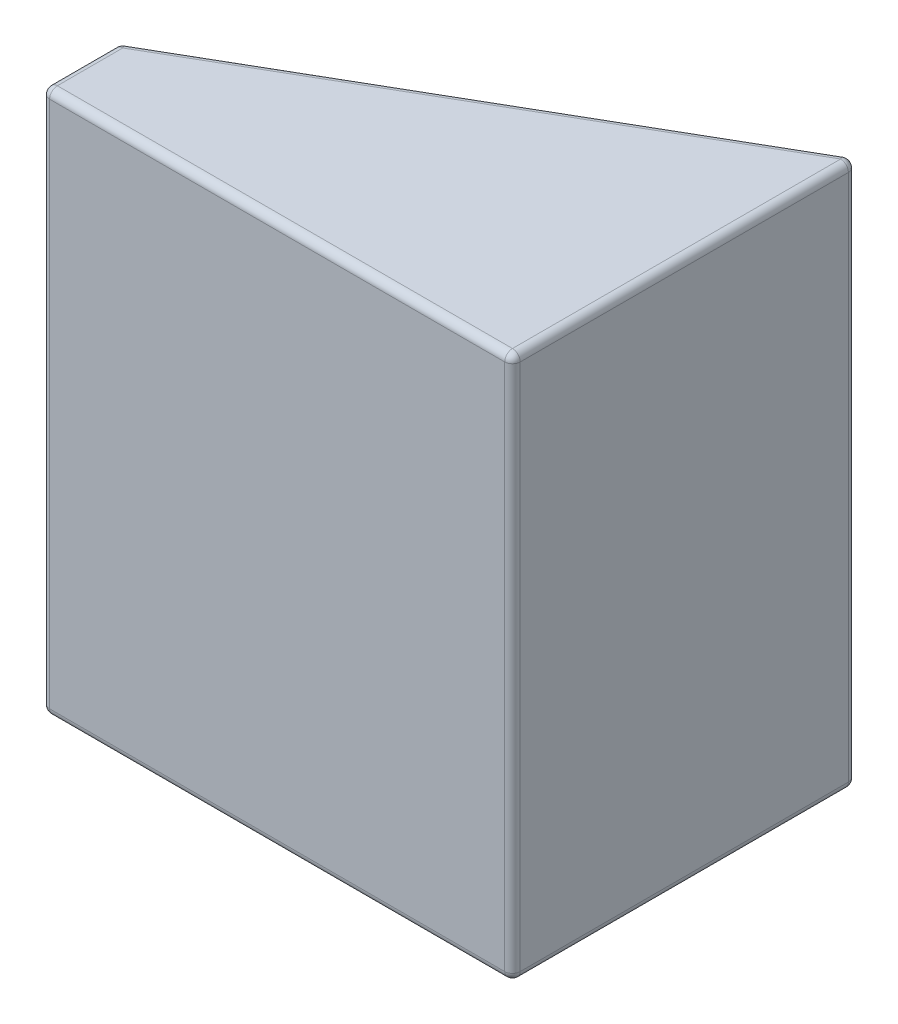
ISO-10303-21;
HEADER;
FILE_DESCRIPTION(('STEP AP214'),'2;1');
FILE_NAME('part.step','',(''),(''),'','','');
FILE_SCHEMA(('AUTOMOTIVE_DESIGN { 1 0 10303 214 1 1 1 1 }'));
ENDSEC;
DATA;
#1=APPLICATION_CONTEXT('core data for automotive mechanical design processes');
#2=APPLICATION_PROTOCOL_DEFINITION('international standard','automotive_design',2000,#1);
#3=PRODUCT_CONTEXT('',#1,'mechanical');
#4=PRODUCT('Part','Part','',(#3));
#5=PRODUCT_RELATED_PRODUCT_CATEGORY('part','',(#4));
#6=PRODUCT_DEFINITION_FORMATION('','',#4);
#7=PRODUCT_DEFINITION_CONTEXT('part definition',#1,'design');
#8=PRODUCT_DEFINITION('design','',#6,#7);
#9=PRODUCT_DEFINITION_SHAPE('','',#8);
#10=(LENGTH_UNIT() NAMED_UNIT(*) SI_UNIT(.MILLI.,.METRE.));
#11=(NAMED_UNIT(*) PLANE_ANGLE_UNIT() SI_UNIT($,.RADIAN.));
#12=(NAMED_UNIT(*) SI_UNIT($,.STERADIAN.) SOLID_ANGLE_UNIT());
#13=UNCERTAINTY_MEASURE_WITH_UNIT(LENGTH_MEASURE(1.E-05),#10,'distance_accuracy_value','');
#14=(GEOMETRIC_REPRESENTATION_CONTEXT(3) GLOBAL_UNCERTAINTY_ASSIGNED_CONTEXT((#13)) GLOBAL_UNIT_ASSIGNED_CONTEXT((#10,
#11,#12)) REPRESENTATION_CONTEXT('',''));
#15=CARTESIAN_POINT('',(0.,0.,0.));
#16=DIRECTION('',(0.,0.,1.));
#17=DIRECTION('',(1.,0.,0.));
#18=AXIS2_PLACEMENT_3D('',#15,#16,#17);
#19=CARTESIAN_POINT('',(153.979316792873,177.8,-88.9));
#20=DIRECTION('',(1.,0.,0.));
#21=DIRECTION('',(0.,0.,-1.));
#22=AXIS2_PLACEMENT_3D('',#19,#20,#21);
#23=PLANE('',#22);
#24=DIRECTION('',(0.,0.,1.));
#25=VECTOR('',#24,1.);
#26=CARTESIAN_POINT('',(153.979316792873,175.26,25.4));
#27=LINE('',#26,#25);
#28=CARTESIAN_POINT('',(153.979316792873,175.26,-84.500590948775));
#29=VERTEX_POINT('',#28);
#30=CARTESIAN_POINT('',(153.979316792873,175.26,22.86));
#31=VERTEX_POINT('',#30);
#32=EDGE_CURVE('E233',#29,#31,#27,.T.);
#33=ORIENTED_EDGE('',*,*,#32,.T.);
#34=DIRECTION('',(0.,-1.,0.));
#35=VECTOR('',#34,1.);
#36=CARTESIAN_POINT('',(153.979316792873,177.8,22.86));
#37=LINE('',#36,#35);
#38=CARTESIAN_POINT('',(153.979316792873,2.54,22.86));
#39=VERTEX_POINT('',#38);
#40=EDGE_CURVE('E235',#31,#39,#37,.T.);
#41=ORIENTED_EDGE('',*,*,#40,.T.);
#42=DIRECTION('',(0.,0.,1.));
#43=VECTOR('',#42,1.);
#44=CARTESIAN_POINT('',(153.979316792873,2.53999999999999,-88.9));
#45=LINE('',#44,#43);
#46=CARTESIAN_POINT('',(153.979316792873,2.54,-84.500590948775));
#47=VERTEX_POINT('',#46);
#48=EDGE_CURVE('E231',#39,#47,#45,.F.);
#49=ORIENTED_EDGE('',*,*,#48,.T.);
#50=DIRECTION('',(0.,-1.,0.));
#51=VECTOR('',#50,1.);
#52=CARTESIAN_POINT('',(153.979316792873,177.8,-84.500590948775));
#53=LINE('',#52,#51);
#54=EDGE_CURVE('E229',#47,#29,#53,.F.);
#55=ORIENTED_EDGE('',*,*,#54,.T.);
#56=EDGE_LOOP('',(#33,#41,#49,#55));
#57=FACE_BOUND('',#56,.T.);
#58=ADVANCED_FACE('F39',(#57),#23,.T.);
#59=CARTESIAN_POINT('',(0.,177.8,0.));
#60=DIRECTION('',(-0.5,0.,-0.866025403784439));
#61=DIRECTION('',(-0.866025403784439,0.,0.5));
#62=AXIS2_PLACEMENT_3D('',#59,#60,#61);
#63=PLANE('',#62);
#64=CARTESIAN_POINT('',(76.9896583964366,88.9,-44.45));
#65=DIRECTION('',(-0.5,0.,-0.866025403784439));
#66=DIRECTION('',(-0.866025403784439,0.,0.5));
#67=AXIS2_PLACEMENT_3D('',#64,#65,#66);
#68=CIRCLE('',#67,75.7555);
#69=CARTESIAN_POINT('',(11.3834709200446,88.9,-6.57225));
#70=VERTEX_POINT('',#69);
#71=EDGE_CURVE('E209',#70,#70,#68,.F.);
#72=ORIENTED_EDGE('',*,*,#71,.T.);
#73=EDGE_LOOP('',(#72));
#74=FACE_BOUND('',#73,.T.);
#75=DIRECTION('',(0.866025403784439,0.,-0.5));
#76=VECTOR('',#75,1.);
#77=CARTESIAN_POINT('',(0.,2.53999999999999,0.));
#78=LINE('',#77,#76);
#79=CARTESIAN_POINT('',(150.169316792873,2.54,-86.7002954743875));
#80=VERTEX_POINT('',#79);
#81=CARTESIAN_POINT('',(1.27,2.54,-0.733234841870825));
#82=VERTEX_POINT('',#81);
#83=EDGE_CURVE('E138',#80,#82,#78,.F.);
#84=ORIENTED_EDGE('',*,*,#83,.T.);
#85=DIRECTION('',(0.,-1.,0.));
#86=VECTOR('',#85,1.);
#87=CARTESIAN_POINT('',(1.27,177.8,-0.733234841870825));
#88=LINE('',#87,#86);
#89=CARTESIAN_POINT('',(1.27,175.26,-0.733234841870825));
#90=VERTEX_POINT('',#89);
#91=EDGE_CURVE('E134',#82,#90,#88,.F.);
#92=ORIENTED_EDGE('',*,*,#91,.T.);
#93=DIRECTION('',(0.866025403784439,0.,-0.5));
#94=VECTOR('',#93,1.);
#95=CARTESIAN_POINT('',(153.979316792873,175.26,-88.9));
#96=LINE('',#95,#94);
#97=CARTESIAN_POINT('',(150.169316792873,175.26,-86.7002954743875));
#98=VERTEX_POINT('',#97);
#99=EDGE_CURVE('E128',#90,#98,#96,.T.);
#100=ORIENTED_EDGE('',*,*,#99,.T.);
#101=DIRECTION('',(0.,-1.,0.));
#102=VECTOR('',#101,1.);
#103=CARTESIAN_POINT('',(150.169316792873,177.8,-86.7002954743875));
#104=LINE('',#103,#102);
#105=EDGE_CURVE('E131',#98,#80,#104,.T.);
#106=ORIENTED_EDGE('',*,*,#105,.T.);
#107=EDGE_LOOP('',(#84,#92,#100,#106));
#108=FACE_BOUND('',#107,.T.);
#109=ADVANCED_FACE('F130',(#74,#108),#63,.T.);
#110=CARTESIAN_POINT('',(0.,177.8,0.));
#111=DIRECTION('',(0.,-1.,0.));
#112=DIRECTION('',(0.,0.,-1.));
#113=AXIS2_PLACEMENT_3D('',#110,#111,#112);
#114=PLANE('',#113);
#115=DIRECTION('',(0.,0.,1.));
#116=VECTOR('',#115,1.);
#117=CARTESIAN_POINT('',(2.54,177.8,25.4));
#118=LINE('',#117,#116);
#119=CARTESIAN_POINT('',(2.54,177.8,1.46646968374165));
#120=VERTEX_POINT('',#119);
#121=CARTESIAN_POINT('',(2.54,177.8,22.86));
#122=VERTEX_POINT('',#121);
#123=EDGE_CURVE('E213',#120,#122,#118,.T.);
#124=ORIENTED_EDGE('',*,*,#123,.T.);
#125=DIRECTION('',(1.,0.,0.));
#126=VECTOR('',#125,1.);
#127=CARTESIAN_POINT('',(153.979316792873,177.8,22.86));
#128=LINE('',#127,#126);
#129=CARTESIAN_POINT('',(151.439316792873,177.8,22.86));
#130=VERTEX_POINT('',#129);
#131=EDGE_CURVE('E217',#122,#130,#128,.T.);
#132=ORIENTED_EDGE('',*,*,#131,.T.);
#133=DIRECTION('',(0.,0.,1.));
#134=VECTOR('',#133,1.);
#135=CARTESIAN_POINT('',(151.439316792873,177.8,-88.9));
#136=LINE('',#135,#134);
#137=CARTESIAN_POINT('',(151.439316792873,177.8,-84.500590948775));
#138=VERTEX_POINT('',#137);
#139=EDGE_CURVE('E215',#130,#138,#136,.F.);
#140=ORIENTED_EDGE('',*,*,#139,.T.);
#141=DIRECTION('',(0.866025403784439,0.,-0.5));
#142=VECTOR('',#141,1.);
#143=CARTESIAN_POINT('',(1.27,177.8,2.19970452561247));
#144=LINE('',#143,#142);
#145=EDGE_CURVE('E156',#138,#120,#144,.F.);
#146=ORIENTED_EDGE('',*,*,#145,.T.);
#147=EDGE_LOOP('',(#124,#132,#140,#146));
#148=FACE_BOUND('',#147,.T.);
#149=ADVANCED_FACE('F340',(#148),#114,.F.);
#150=CARTESIAN_POINT('',(0.,0.,0.));
#151=DIRECTION('',(0.,-1.,0.));
#152=DIRECTION('',(0.,0.,-1.));
#153=AXIS2_PLACEMENT_3D('',#150,#151,#152);
#154=PLANE('',#153);
#155=DIRECTION('',(0.,0.,1.));
#156=VECTOR('',#155,1.);
#157=CARTESIAN_POINT('',(151.439316792873,0.,0.));
#158=LINE('',#157,#156);
#159=CARTESIAN_POINT('',(151.439316792873,0.,-84.500590948775));
#160=VERTEX_POINT('',#159);
#161=CARTESIAN_POINT('',(151.439316792873,0.,22.86));
#162=VERTEX_POINT('',#161);
#163=EDGE_CURVE('E242',#160,#162,#158,.T.);
#164=ORIENTED_EDGE('',*,*,#163,.T.);
#165=DIRECTION('',(-1.,0.,0.));
#166=VECTOR('',#165,1.);
#167=CARTESIAN_POINT('',(0.,0.,22.86));
#168=LINE('',#167,#166);
#169=CARTESIAN_POINT('',(2.54,0.,22.86));
#170=VERTEX_POINT('',#169);
#171=EDGE_CURVE('E244',#162,#170,#168,.T.);
#172=ORIENTED_EDGE('',*,*,#171,.T.);
#173=DIRECTION('',(0.,0.,-1.));
#174=VECTOR('',#173,1.);
#175=CARTESIAN_POINT('',(2.54,0.,0.));
#176=LINE('',#175,#174);
#177=CARTESIAN_POINT('',(2.53999999999999,0.,1.46646968374165));
#178=VERTEX_POINT('',#177);
#179=EDGE_CURVE('E240',#170,#178,#176,.T.);
#180=ORIENTED_EDGE('',*,*,#179,.T.);
#181=DIRECTION('',(0.866025403784439,0.,-0.5));
#182=VECTOR('',#181,1.);
#183=CARTESIAN_POINT('',(1.27,0.,2.19970452561247));
#184=LINE('',#183,#182);
#185=EDGE_CURVE('E238',#178,#160,#184,.T.);
#186=ORIENTED_EDGE('',*,*,#185,.T.);
#187=EDGE_LOOP('',(#164,#172,#180,#186));
#188=FACE_BOUND('',#187,.T.);
#189=ADVANCED_FACE('F539',(#188),#154,.T.);
#190=CARTESIAN_POINT('',(0.,333.860212738545,0.));
#191=DIRECTION('',(-1.,0.,0.));
#192=DIRECTION('',(0.,0.,1.));
#193=AXIS2_PLACEMENT_3D('',#190,#191,#192);
#194=PLANE('',#193);
#195=DIRECTION('',(0.,0.,-1.));
#196=VECTOR('',#195,1.);
#197=CARTESIAN_POINT('',(0.,2.53999999999999,0.));
#198=LINE('',#197,#196);
#199=CARTESIAN_POINT('',(0.,2.54,1.46646968374165));
#200=VERTEX_POINT('',#199);
#201=CARTESIAN_POINT('',(0.,2.54,22.86));
#202=VERTEX_POINT('',#201);
#203=EDGE_CURVE('E48',#200,#202,#198,.F.);
#204=ORIENTED_EDGE('',*,*,#203,.T.);
#205=DIRECTION('',(0.,-1.,0.));
#206=VECTOR('',#205,1.);
#207=CARTESIAN_POINT('',(0.,333.860212738545,22.86));
#208=LINE('',#207,#206);
#209=CARTESIAN_POINT('',(0.,175.26,22.86));
#210=VERTEX_POINT('',#209);
#211=EDGE_CURVE('E11',#202,#210,#208,.F.);
#212=ORIENTED_EDGE('',*,*,#211,.T.);
#213=DIRECTION('',(0.,0.,1.));
#214=VECTOR('',#213,1.);
#215=CARTESIAN_POINT('',(0.,175.26,0.));
#216=LINE('',#215,#214);
#217=CARTESIAN_POINT('',(0.,175.26,1.46646968374165));
#218=VERTEX_POINT('',#217);
#219=EDGE_CURVE('E249',#210,#218,#216,.F.);
#220=ORIENTED_EDGE('',*,*,#219,.T.);
#221=DIRECTION('',(0.,-1.,0.));
#222=VECTOR('',#221,1.);
#223=CARTESIAN_POINT('',(0.,333.860212738545,1.46646968374165));
#224=LINE('',#223,#222);
#225=EDGE_CURVE('E247',#218,#200,#224,.T.);
#226=ORIENTED_EDGE('',*,*,#225,.T.);
#227=EDGE_LOOP('',(#204,#212,#220,#226));
#228=FACE_BOUND('',#227,.T.);
#229=ADVANCED_FACE('F320',(#228),#194,.T.);
#230=CARTESIAN_POINT('',(153.979316792873,333.860212738545,25.4));
#231=DIRECTION('',(0.,0.,1.));
#232=DIRECTION('',(1.,0.,0.));
#233=AXIS2_PLACEMENT_3D('',#230,#231,#232);
#234=PLANE('',#233);
#235=DIRECTION('',(0.,-1.,0.));
#236=VECTOR('',#235,1.);
#237=CARTESIAN_POINT('',(151.439316792873,333.860212738545,25.4));
#238=LINE('',#237,#236);
#239=CARTESIAN_POINT('',(151.439316792873,2.54,25.4));
#240=VERTEX_POINT('',#239);
#241=CARTESIAN_POINT('',(151.439316792873,175.26,25.4));
#242=VERTEX_POINT('',#241);
#243=EDGE_CURVE('E224',#240,#242,#238,.F.);
#244=ORIENTED_EDGE('',*,*,#243,.T.);
#245=DIRECTION('',(1.,0.,0.));
#246=VECTOR('',#245,1.);
#247=CARTESIAN_POINT('',(0.,175.26,25.4));
#248=LINE('',#247,#246);
#249=CARTESIAN_POINT('',(2.53999999999999,175.26,25.4));
#250=VERTEX_POINT('',#249);
#251=EDGE_CURVE('E226',#242,#250,#248,.F.);
#252=ORIENTED_EDGE('',*,*,#251,.T.);
#253=DIRECTION('',(0.,-1.,0.));
#254=VECTOR('',#253,1.);
#255=CARTESIAN_POINT('',(2.53999999999999,333.860212738545,25.4));
#256=LINE('',#255,#254);
#257=CARTESIAN_POINT('',(2.53999999999999,2.54,25.4));
#258=VERTEX_POINT('',#257);
#259=EDGE_CURVE('E220',#250,#258,#256,.T.);
#260=ORIENTED_EDGE('',*,*,#259,.T.);
#261=DIRECTION('',(-1.,0.,0.));
#262=VECTOR('',#261,1.);
#263=CARTESIAN_POINT('',(153.979316792873,2.53999999999999,25.4));
#264=LINE('',#263,#262);
#265=EDGE_CURVE('E222',#258,#240,#264,.F.);
#266=ORIENTED_EDGE('',*,*,#265,.T.);
#267=EDGE_LOOP('',(#244,#252,#260,#266));
#268=FACE_BOUND('',#267,.T.);
#269=ADVANCED_FACE('F311',(#268),#234,.T.);
#270=CARTESIAN_POINT('',(89.6896583964366,88.9,-22.4529547438753));
#271=DIRECTION('',(-0.5,0.,-0.866025403784439));
#272=DIRECTION('',(-0.866025403784439,0.,0.5));
#273=AXIS2_PLACEMENT_3D('',#270,#271,#272);
#274=CYLINDRICAL_SURFACE('',#273,73.2155);
#275=CARTESIAN_POINT('',(78.2596583964366,88.9,-42.2502954743875));
#276=DIRECTION('',(-0.5,0.,-0.866025403784439));
#277=DIRECTION('',(-0.866025403784439,0.,0.5));
#278=AXIS2_PLACEMENT_3D('',#275,#276,#277);
#279=CIRCLE('',#278,73.2155);
#280=CARTESIAN_POINT('',(14.853175445657,88.9,-5.64254547438754));
#281=VERTEX_POINT('',#280);
#282=EDGE_CURVE('E150',#281,#281,#279,.T.);
#283=ORIENTED_EDGE('',*,*,#282,.T.);
#284=EDGE_LOOP('',(#283));
#285=FACE_BOUND('',#284,.T.);
#286=CARTESIAN_POINT('',(89.6896583964366,88.9,-22.4529547438753));
#287=DIRECTION('',(-0.5,0.,-0.866025403784439));
#288=DIRECTION('',(-0.866025403784439,0.,0.5));
#289=AXIS2_PLACEMENT_3D('',#286,#287,#288);
#290=CIRCLE('',#289,73.2155);
#291=CARTESIAN_POINT('',(26.283175445657,88.9,14.1547952561247));
#292=VERTEX_POINT('',#291);
#293=EDGE_CURVE('E195',#292,#292,#290,.T.);
#294=ORIENTED_EDGE('',*,*,#293,.F.);
#295=EDGE_LOOP('',(#294));
#296=FACE_BOUND('',#295,.T.);
#297=ADVANCED_FACE('F517',(#285,#296),#274,.F.);
#298=CARTESIAN_POINT('',(89.6896583964366,88.9,-22.4529547438753));
#299=DIRECTION('',(-0.5,0.,-0.866025403784439));
#300=DIRECTION('',(-0.866025403784439,0.,0.5));
#301=AXIS2_PLACEMENT_3D('',#298,#299,#300);
#302=PLANE('',#301);
#303=ORIENTED_EDGE('',*,*,#293,.T.);
#304=EDGE_LOOP('',(#303));
#305=FACE_BOUND('',#304,.T.);
#306=ADVANCED_FACE('F347',(#305),#302,.T.);
#307=CARTESIAN_POINT('',(78.2596583964366,88.9,-42.2502954743875));
#308=DIRECTION('',(-0.5,0.,-0.866025403784439));
#309=DIRECTION('',(-0.866025403784439,0.,0.5));
#310=AXIS2_PLACEMENT_3D('',#307,#308,#309);
#311=TOROIDAL_SURFACE('',#310,75.7555,2.54);
#312=ORIENTED_EDGE('',*,*,#71,.F.);
#313=EDGE_LOOP('',(#312));
#314=FACE_BOUND('',#313,.T.);
#315=ORIENTED_EDGE('',*,*,#282,.F.);
#316=EDGE_LOOP('',(#315));
#317=FACE_BOUND('',#316,.T.);
#318=ADVANCED_FACE('F333',(#314,#317),#311,.T.);
#319=CARTESIAN_POINT('',(1.27,2.54,2.19970452561247));
#320=DIRECTION('',(0.866025403784439,0.,-0.5));
#321=DIRECTION('',(-0.5,0.,-0.866025403784439));
#322=AXIS2_PLACEMENT_3D('',#319,#320,#321);
#323=CYLINDRICAL_SURFACE('',#322,2.54);
#324=CARTESIAN_POINT('',(2.54,2.54,1.46646968374165));
#325=DIRECTION('',(-0.866025403784439,0.,0.5));
#326=DIRECTION('',(0.5,0.,0.866025403784439));
#327=AXIS2_PLACEMENT_3D('',#324,#325,#326);
#328=CIRCLE('',#327,2.54);
#329=EDGE_CURVE('E43',#82,#178,#328,.T.);
#330=ORIENTED_EDGE('',*,*,#329,.F.);
#331=ORIENTED_EDGE('',*,*,#83,.F.);
#332=CARTESIAN_POINT('',(151.439316792873,2.54,-84.500590948775));
#333=DIRECTION('',(0.86602540378444,0.,-0.499999999999997));
#334=DIRECTION('',(-0.499999999999997,0.,-0.86602540378444));
#335=AXIS2_PLACEMENT_3D('',#332,#333,#334);
#336=CIRCLE('',#335,2.54);
#337=EDGE_CURVE('E189',#160,#80,#336,.T.);
#338=ORIENTED_EDGE('',*,*,#337,.F.);
#339=ORIENTED_EDGE('',*,*,#185,.F.);
#340=EDGE_LOOP('',(#330,#331,#338,#339));
#341=FACE_BOUND('',#340,.T.);
#342=ADVANCED_FACE('F41',(#341),#323,.T.);
#343=CARTESIAN_POINT('',(2.54,2.54,1.46646968374165));
#344=DIRECTION('',(0.,-1.,0.));
#345=DIRECTION('',(0.,0.,-1.));
#346=AXIS2_PLACEMENT_3D('',#343,#344,#345);
#347=SPHERICAL_SURFACE('',#346,2.54);
#348=CARTESIAN_POINT('',(2.54,2.54,1.46646968374165));
#349=DIRECTION('',(0.,-1.,0.));
#350=DIRECTION('',(0.,0.,-1.));
#351=AXIS2_PLACEMENT_3D('',#348,#349,#350);
#352=CIRCLE('',#351,2.54);
#353=EDGE_CURVE('E184',#82,#200,#352,.F.);
#354=ORIENTED_EDGE('',*,*,#353,.F.);
#355=ORIENTED_EDGE('',*,*,#329,.T.);
#356=CARTESIAN_POINT('',(2.54,2.54,1.46646968374167));
#357=DIRECTION('',(0.,0.,-1.));
#358=DIRECTION('',(-1.,0.,0.));
#359=AXIS2_PLACEMENT_3D('',#356,#357,#358);
#360=CIRCLE('',#359,2.54);
#361=EDGE_CURVE('E187',#200,#178,#360,.F.);
#362=ORIENTED_EDGE('',*,*,#361,.F.);
#363=EDGE_LOOP('',(#354,#355,#362));
#364=FACE_BOUND('',#363,.T.);
#365=ADVANCED_FACE('F325',(#364),#347,.T.);
#366=CARTESIAN_POINT('',(151.439316792873,2.54,-84.500590948775));
#367=DIRECTION('',(0.,-1.,0.));
#368=DIRECTION('',(0.,0.,-1.));
#369=AXIS2_PLACEMENT_3D('',#366,#367,#368);
#370=SPHERICAL_SURFACE('',#369,2.54);
#371=CARTESIAN_POINT('',(151.439316792873,2.54,-84.500590948775));
#372=DIRECTION('',(0.,0.,-1.));
#373=DIRECTION('',(-1.,0.,0.));
#374=AXIS2_PLACEMENT_3D('',#371,#372,#373);
#375=CIRCLE('',#374,2.54);
#376=EDGE_CURVE('E180',#160,#47,#375,.F.);
#377=ORIENTED_EDGE('',*,*,#376,.F.);
#378=ORIENTED_EDGE('',*,*,#337,.T.);
#379=CARTESIAN_POINT('',(151.439316792873,2.54,-84.500590948775));
#380=DIRECTION('',(0.,-1.,0.));
#381=DIRECTION('',(0.,0.,-1.));
#382=AXIS2_PLACEMENT_3D('',#379,#380,#381);
#383=CIRCLE('',#382,2.54);
#384=EDGE_CURVE('E149',#47,#80,#383,.F.);
#385=ORIENTED_EDGE('',*,*,#384,.F.);
#386=EDGE_LOOP('',(#377,#378,#385));
#387=FACE_BOUND('',#386,.T.);
#388=ADVANCED_FACE('F327',(#387),#370,.T.);
#389=CARTESIAN_POINT('',(2.54,2.54,0.));
#390=DIRECTION('',(0.,0.,-1.));
#391=DIRECTION('',(-1.,0.,0.));
#392=AXIS2_PLACEMENT_3D('',#389,#390,#391);
#393=CYLINDRICAL_SURFACE('',#392,2.54);
#394=ORIENTED_EDGE('',*,*,#361,.T.);
#395=ORIENTED_EDGE('',*,*,#179,.F.);
#396=CARTESIAN_POINT('',(2.54,2.54,22.86));
#397=DIRECTION('',(0.,0.,1.));
#398=DIRECTION('',(1.,0.,0.));
#399=AXIS2_PLACEMENT_3D('',#396,#397,#398);
#400=CIRCLE('',#399,2.54);
#401=EDGE_CURVE('E175',#202,#170,#400,.T.);
#402=ORIENTED_EDGE('',*,*,#401,.F.);
#403=ORIENTED_EDGE('',*,*,#203,.F.);
#404=EDGE_LOOP('',(#394,#395,#402,#403));
#405=FACE_BOUND('',#404,.T.);
#406=ADVANCED_FACE('F319',(#405),#393,.T.);
#407=CARTESIAN_POINT('',(2.54,333.860212738545,1.46646968374165));
#408=DIRECTION('',(0.,-1.,0.));
#409=DIRECTION('',(0.,0.,-1.));
#410=AXIS2_PLACEMENT_3D('',#407,#408,#409);
#411=CYLINDRICAL_SURFACE('',#410,2.54);
#412=ORIENTED_EDGE('',*,*,#353,.T.);
#413=ORIENTED_EDGE('',*,*,#225,.F.);
#414=CARTESIAN_POINT('',(2.54,175.26,1.46646968374165));
#415=DIRECTION('',(0.,1.,0.));
#416=DIRECTION('',(0.,0.,1.));
#417=AXIS2_PLACEMENT_3D('',#414,#415,#416);
#418=CIRCLE('',#417,2.54);
#419=EDGE_CURVE('E172',#90,#218,#418,.T.);
#420=ORIENTED_EDGE('',*,*,#419,.F.);
#421=ORIENTED_EDGE('',*,*,#91,.F.);
#422=EDGE_LOOP('',(#412,#413,#420,#421));
#423=FACE_BOUND('',#422,.T.);
#424=ADVANCED_FACE('F324',(#423),#411,.T.);
#425=CARTESIAN_POINT('',(1.27,175.26,2.19970452561247));
#426=DIRECTION('',(-0.866025403784439,0.,0.5));
#427=DIRECTION('',(0.5,0.,0.866025403784439));
#428=AXIS2_PLACEMENT_3D('',#425,#426,#427);
#429=CYLINDRICAL_SURFACE('',#428,2.54);
#430=CARTESIAN_POINT('',(151.439316792873,175.26,-84.500590948775));
#431=DIRECTION('',(0.86602540378444,0.,-0.499999999999997));
#432=DIRECTION('',(-0.499999999999997,0.,-0.86602540378444));
#433=AXIS2_PLACEMENT_3D('',#430,#431,#432);
#434=CIRCLE('',#433,2.54);
#435=EDGE_CURVE('E154',#98,#138,#434,.T.);
#436=ORIENTED_EDGE('',*,*,#435,.F.);
#437=ORIENTED_EDGE('',*,*,#99,.F.);
#438=CARTESIAN_POINT('',(2.54,175.26,1.46646968374165));
#439=DIRECTION('',(-0.866025403784439,0.,0.5));
#440=DIRECTION('',(0.5,0.,0.866025403784439));
#441=AXIS2_PLACEMENT_3D('',#438,#439,#440);
#442=CIRCLE('',#441,2.54);
#443=EDGE_CURVE('E159',#120,#90,#442,.T.);
#444=ORIENTED_EDGE('',*,*,#443,.F.);
#445=ORIENTED_EDGE('',*,*,#145,.F.);
#446=EDGE_LOOP('',(#436,#437,#444,#445));
#447=FACE_BOUND('',#446,.T.);
#448=ADVANCED_FACE('F155',(#447),#429,.T.);
#449=CARTESIAN_POINT('',(151.439316792873,177.8,-84.500590948775));
#450=DIRECTION('',(0.,-1.,0.));
#451=DIRECTION('',(0.,0.,-1.));
#452=AXIS2_PLACEMENT_3D('',#449,#450,#451);
#453=CYLINDRICAL_SURFACE('',#452,2.54);
#454=ORIENTED_EDGE('',*,*,#384,.T.);
#455=ORIENTED_EDGE('',*,*,#105,.F.);
#456=CARTESIAN_POINT('',(151.439316792873,175.26,-84.500590948775));
#457=DIRECTION('',(0.,1.,0.));
#458=DIRECTION('',(0.,0.,1.));
#459=AXIS2_PLACEMENT_3D('',#456,#457,#458);
#460=CIRCLE('',#459,2.54);
#461=EDGE_CURVE('E146',#29,#98,#460,.T.);
#462=ORIENTED_EDGE('',*,*,#461,.F.);
#463=ORIENTED_EDGE('',*,*,#54,.F.);
#464=EDGE_LOOP('',(#454,#455,#462,#463));
#465=FACE_BOUND('',#464,.T.);
#466=ADVANCED_FACE('F143',(#465),#453,.T.);
#467=CARTESIAN_POINT('',(151.439316792873,2.54,0.));
#468=DIRECTION('',(0.,0.,1.));
#469=DIRECTION('',(1.,0.,0.));
#470=AXIS2_PLACEMENT_3D('',#467,#468,#469);
#471=CYLINDRICAL_SURFACE('',#470,2.54);
#472=ORIENTED_EDGE('',*,*,#376,.T.);
#473=ORIENTED_EDGE('',*,*,#48,.F.);
#474=CARTESIAN_POINT('',(151.439316792873,2.54,22.86));
#475=DIRECTION('',(0.,0.,1.));
#476=DIRECTION('',(1.,0.,0.));
#477=AXIS2_PLACEMENT_3D('',#474,#475,#476);
#478=CIRCLE('',#477,2.54);
#479=EDGE_CURVE('E164',#162,#39,#478,.T.);
#480=ORIENTED_EDGE('',*,*,#479,.F.);
#481=ORIENTED_EDGE('',*,*,#163,.F.);
#482=EDGE_LOOP('',(#472,#473,#480,#481));
#483=FACE_BOUND('',#482,.T.);
#484=ADVANCED_FACE('F292',(#483),#471,.T.);
#485=CARTESIAN_POINT('',(0.,2.54,22.86));
#486=DIRECTION('',(-1.,0.,0.));
#487=DIRECTION('',(0.,0.,1.));
#488=AXIS2_PLACEMENT_3D('',#485,#486,#487);
#489=CYLINDRICAL_SURFACE('',#488,2.54);
#490=CARTESIAN_POINT('',(2.54,2.54,22.86));
#491=DIRECTION('',(-1.,0.,0.));
#492=DIRECTION('',(0.,0.,1.));
#493=AXIS2_PLACEMENT_3D('',#490,#491,#492);
#494=CIRCLE('',#493,2.54);
#495=EDGE_CURVE('E177',#170,#258,#494,.T.);
#496=ORIENTED_EDGE('',*,*,#495,.F.);
#497=ORIENTED_EDGE('',*,*,#171,.F.);
#498=CARTESIAN_POINT('',(151.439316792873,2.54,22.86));
#499=DIRECTION('',(1.,0.,0.));
#500=DIRECTION('',(0.,0.,-1.));
#501=AXIS2_PLACEMENT_3D('',#498,#499,#500);
#502=CIRCLE('',#501,2.54);
#503=EDGE_CURVE('E167',#240,#162,#502,.T.);
#504=ORIENTED_EDGE('',*,*,#503,.F.);
#505=ORIENTED_EDGE('',*,*,#265,.F.);
#506=EDGE_LOOP('',(#496,#497,#504,#505));
#507=FACE_BOUND('',#506,.T.);
#508=ADVANCED_FACE('F287',(#507),#489,.T.);
#509=CARTESIAN_POINT('',(2.54,2.54,22.86));
#510=DIRECTION('',(0.,-1.,0.));
#511=DIRECTION('',(0.,0.,-1.));
#512=AXIS2_PLACEMENT_3D('',#509,#510,#511);
#513=SPHERICAL_SURFACE('',#512,2.54);
#514=ORIENTED_EDGE('',*,*,#401,.T.);
#515=ORIENTED_EDGE('',*,*,#495,.T.);
#516=CARTESIAN_POINT('',(2.53999999999999,2.54,22.86));
#517=DIRECTION('',(0.,-1.,0.));
#518=DIRECTION('',(0.,0.,-1.));
#519=AXIS2_PLACEMENT_3D('',#516,#517,#518);
#520=CIRCLE('',#519,2.54);
#521=EDGE_CURVE('E274',#202,#258,#520,.F.);
#522=ORIENTED_EDGE('',*,*,#521,.F.);
#523=EDGE_LOOP('',(#514,#515,#522));
#524=FACE_BOUND('',#523,.T.);
#525=ADVANCED_FACE('F316',(#524),#513,.T.);
#526=CARTESIAN_POINT('',(2.54,175.26,1.46646968374165));
#527=DIRECTION('',(0.,1.,0.));
#528=DIRECTION('',(0.,0.,1.));
#529=AXIS2_PLACEMENT_3D('',#526,#527,#528);
#530=SPHERICAL_SURFACE('',#529,2.54);
#531=ORIENTED_EDGE('',*,*,#443,.T.);
#532=ORIENTED_EDGE('',*,*,#419,.T.);
#533=CARTESIAN_POINT('',(2.54,175.26,1.46646968374165));
#534=DIRECTION('',(0.,0.,-1.));
#535=DIRECTION('',(-1.,0.,0.));
#536=AXIS2_PLACEMENT_3D('',#533,#534,#535);
#537=CIRCLE('',#536,2.54);
#538=EDGE_CURVE('E271',#120,#218,#537,.F.);
#539=ORIENTED_EDGE('',*,*,#538,.F.);
#540=EDGE_LOOP('',(#531,#532,#539));
#541=FACE_BOUND('',#540,.T.);
#542=ADVANCED_FACE('F371',(#541),#530,.T.);
#543=CARTESIAN_POINT('',(151.439316792873,175.26,-84.500590948775));
#544=DIRECTION('',(0.,1.,0.));
#545=DIRECTION('',(0.,0.,1.));
#546=AXIS2_PLACEMENT_3D('',#543,#544,#545);
#547=SPHERICAL_SURFACE('',#546,2.54);
#548=ORIENTED_EDGE('',*,*,#461,.T.);
#549=ORIENTED_EDGE('',*,*,#435,.T.);
#550=CARTESIAN_POINT('',(151.439316792873,175.26,-84.500590948775));
#551=DIRECTION('',(0.,0.,-1.));
#552=DIRECTION('',(-1.,0.,0.));
#553=AXIS2_PLACEMENT_3D('',#550,#551,#552);
#554=CIRCLE('',#553,2.54);
#555=EDGE_CURVE('E162',#29,#138,#554,.F.);
#556=ORIENTED_EDGE('',*,*,#555,.F.);
#557=EDGE_LOOP('',(#548,#549,#556));
#558=FACE_BOUND('',#557,.T.);
#559=ADVANCED_FACE('F161',(#558),#547,.T.);
#560=CARTESIAN_POINT('',(151.439316792873,2.54,22.86));
#561=DIRECTION('',(0.,-1.,0.));
#562=DIRECTION('',(0.,0.,-1.));
#563=AXIS2_PLACEMENT_3D('',#560,#561,#562);
#564=SPHERICAL_SURFACE('',#563,2.54);
#565=ORIENTED_EDGE('',*,*,#503,.T.);
#566=ORIENTED_EDGE('',*,*,#479,.T.);
#567=CARTESIAN_POINT('',(151.439316792873,2.54,22.86));
#568=DIRECTION('',(0.,-1.,0.));
#569=DIRECTION('',(0.,0.,-1.));
#570=AXIS2_PLACEMENT_3D('',#567,#568,#569);
#571=CIRCLE('',#570,2.54);
#572=EDGE_CURVE('E268',#240,#39,#571,.F.);
#573=ORIENTED_EDGE('',*,*,#572,.F.);
#574=EDGE_LOOP('',(#565,#566,#573));
#575=FACE_BOUND('',#574,.T.);
#576=ADVANCED_FACE('F279',(#575),#564,.T.);
#577=CARTESIAN_POINT('',(2.53999999999999,333.860212738545,22.86));
#578=DIRECTION('',(0.,-1.,0.));
#579=DIRECTION('',(0.,0.,-1.));
#580=AXIS2_PLACEMENT_3D('',#577,#578,#579);
#581=CYLINDRICAL_SURFACE('',#580,2.54);
#582=ORIENTED_EDGE('',*,*,#521,.T.);
#583=ORIENTED_EDGE('',*,*,#259,.F.);
#584=CARTESIAN_POINT('',(2.54,175.26,22.86));
#585=DIRECTION('',(0.,1.,0.));
#586=DIRECTION('',(0.,0.,1.));
#587=AXIS2_PLACEMENT_3D('',#584,#585,#586);
#588=CIRCLE('',#587,2.54);
#589=EDGE_CURVE('E265',#210,#250,#588,.T.);
#590=ORIENTED_EDGE('',*,*,#589,.F.);
#591=ORIENTED_EDGE('',*,*,#211,.F.);
#592=EDGE_LOOP('',(#582,#583,#590,#591));
#593=FACE_BOUND('',#592,.T.);
#594=ADVANCED_FACE('F313',(#593),#581,.T.);
#595=CARTESIAN_POINT('',(2.54,175.26,0.));
#596=DIRECTION('',(0.,0.,-1.));
#597=DIRECTION('',(-1.,0.,0.));
#598=AXIS2_PLACEMENT_3D('',#595,#596,#597);
#599=CYLINDRICAL_SURFACE('',#598,2.54);
#600=ORIENTED_EDGE('',*,*,#538,.T.);
#601=ORIENTED_EDGE('',*,*,#219,.F.);
#602=CARTESIAN_POINT('',(2.54,175.26,22.86));
#603=DIRECTION('',(0.,0.,1.));
#604=DIRECTION('',(1.,0.,0.));
#605=AXIS2_PLACEMENT_3D('',#602,#603,#604);
#606=CIRCLE('',#605,2.54);
#607=EDGE_CURVE('E262',#122,#210,#606,.T.);
#608=ORIENTED_EDGE('',*,*,#607,.F.);
#609=ORIENTED_EDGE('',*,*,#123,.F.);
#610=EDGE_LOOP('',(#600,#601,#608,#609));
#611=FACE_BOUND('',#610,.T.);
#612=ADVANCED_FACE('F361',(#611),#599,.T.);
#613=CARTESIAN_POINT('',(151.439316792873,175.26,-88.9));
#614=DIRECTION('',(0.,0.,-1.));
#615=DIRECTION('',(-1.,0.,0.));
#616=AXIS2_PLACEMENT_3D('',#613,#614,#615);
#617=CYLINDRICAL_SURFACE('',#616,2.54);
#618=ORIENTED_EDGE('',*,*,#555,.T.);
#619=ORIENTED_EDGE('',*,*,#139,.F.);
#620=CARTESIAN_POINT('',(151.439316792873,175.26,22.86));
#621=DIRECTION('',(0.,0.,1.));
#622=DIRECTION('',(0.,-1.,0.));
#623=AXIS2_PLACEMENT_3D('',#620,#621,#622);
#624=CIRCLE('',#623,2.54);
#625=EDGE_CURVE('E259',#31,#130,#624,.T.);
#626=ORIENTED_EDGE('',*,*,#625,.F.);
#627=ORIENTED_EDGE('',*,*,#32,.F.);
#628=EDGE_LOOP('',(#618,#619,#626,#627));
#629=FACE_BOUND('',#628,.T.);
#630=ADVANCED_FACE('F302',(#629),#617,.T.);
#631=CARTESIAN_POINT('',(151.439316792873,177.8,22.86));
#632=DIRECTION('',(0.,-1.,0.));
#633=DIRECTION('',(0.,0.,-1.));
#634=AXIS2_PLACEMENT_3D('',#631,#632,#633);
#635=CYLINDRICAL_SURFACE('',#634,2.54);
#636=ORIENTED_EDGE('',*,*,#572,.T.);
#637=ORIENTED_EDGE('',*,*,#40,.F.);
#638=CARTESIAN_POINT('',(151.439316792873,175.26,22.86));
#639=DIRECTION('',(0.,1.,0.));
#640=DIRECTION('',(0.,0.,1.));
#641=AXIS2_PLACEMENT_3D('',#638,#639,#640);
#642=CIRCLE('',#641,2.54);
#643=EDGE_CURVE('E256',#242,#31,#642,.T.);
#644=ORIENTED_EDGE('',*,*,#643,.F.);
#645=ORIENTED_EDGE('',*,*,#243,.F.);
#646=EDGE_LOOP('',(#636,#637,#644,#645));
#647=FACE_BOUND('',#646,.T.);
#648=ADVANCED_FACE('F298',(#647),#635,.T.);
#649=CARTESIAN_POINT('',(2.54,175.26,22.86));
#650=DIRECTION('',(-1.,0.,0.));
#651=DIRECTION('',(0.,0.,1.));
#652=AXIS2_PLACEMENT_3D('',#649,#650,#651);
#653=SPHERICAL_SURFACE('',#652,2.54);
#654=ORIENTED_EDGE('',*,*,#607,.T.);
#655=ORIENTED_EDGE('',*,*,#589,.T.);
#656=CARTESIAN_POINT('',(2.53999999999999,175.26,22.86));
#657=DIRECTION('',(-1.,0.,0.));
#658=DIRECTION('',(0.,-1.,0.));
#659=AXIS2_PLACEMENT_3D('',#656,#657,#658);
#660=CIRCLE('',#659,2.54);
#661=EDGE_CURVE('E254',#122,#250,#660,.F.);
#662=ORIENTED_EDGE('',*,*,#661,.F.);
#663=EDGE_LOOP('',(#654,#655,#662));
#664=FACE_BOUND('',#663,.T.);
#665=ADVANCED_FACE('F353',(#664),#653,.T.);
#666=CARTESIAN_POINT('',(151.439316792873,175.26,22.86));
#667=DIRECTION('',(1.,0.,0.));
#668=DIRECTION('',(0.,0.,-1.));
#669=AXIS2_PLACEMENT_3D('',#666,#667,#668);
#670=SPHERICAL_SURFACE('',#669,2.54);
#671=ORIENTED_EDGE('',*,*,#643,.T.);
#672=ORIENTED_EDGE('',*,*,#625,.T.);
#673=CARTESIAN_POINT('',(151.439316792873,175.26,22.86));
#674=DIRECTION('',(1.,0.,0.));
#675=DIRECTION('',(0.,0.,-1.));
#676=AXIS2_PLACEMENT_3D('',#673,#674,#675);
#677=CIRCLE('',#676,2.54);
#678=EDGE_CURVE('E252',#242,#130,#677,.F.);
#679=ORIENTED_EDGE('',*,*,#678,.F.);
#680=EDGE_LOOP('',(#671,#672,#679));
#681=FACE_BOUND('',#680,.T.);
#682=ADVANCED_FACE('F305',(#681),#670,.T.);
#683=CARTESIAN_POINT('',(0.,175.26,22.86));
#684=DIRECTION('',(-1.,0.,0.));
#685=DIRECTION('',(0.,0.,1.));
#686=AXIS2_PLACEMENT_3D('',#683,#684,#685);
#687=CYLINDRICAL_SURFACE('',#686,2.54);
#688=ORIENTED_EDGE('',*,*,#661,.T.);
#689=ORIENTED_EDGE('',*,*,#251,.F.);
#690=ORIENTED_EDGE('',*,*,#678,.T.);
#691=ORIENTED_EDGE('',*,*,#131,.F.);
#692=EDGE_LOOP('',(#688,#689,#690,#691));
#693=FACE_BOUND('',#692,.T.);
#694=ADVANCED_FACE('F308',(#693),#687,.T.);
#695=CLOSED_SHELL('',(#58,#109,#149,#189,#229,#269,#297,#306,#318,#342,#365,#388,#406,#424,#448,
#466,#484,#508,#525,#542,#559,#576,#594,#612,#630,#648,#665,#682,#694));
#696=MANIFOLD_SOLID_BREP('B2',#695);
#697=ADVANCED_BREP_SHAPE_REPRESENTATION('',(#18,#696),#14);
#698=SHAPE_DEFINITION_REPRESENTATION(#9,#697);
ENDSEC;
END-ISO-10303-21;
